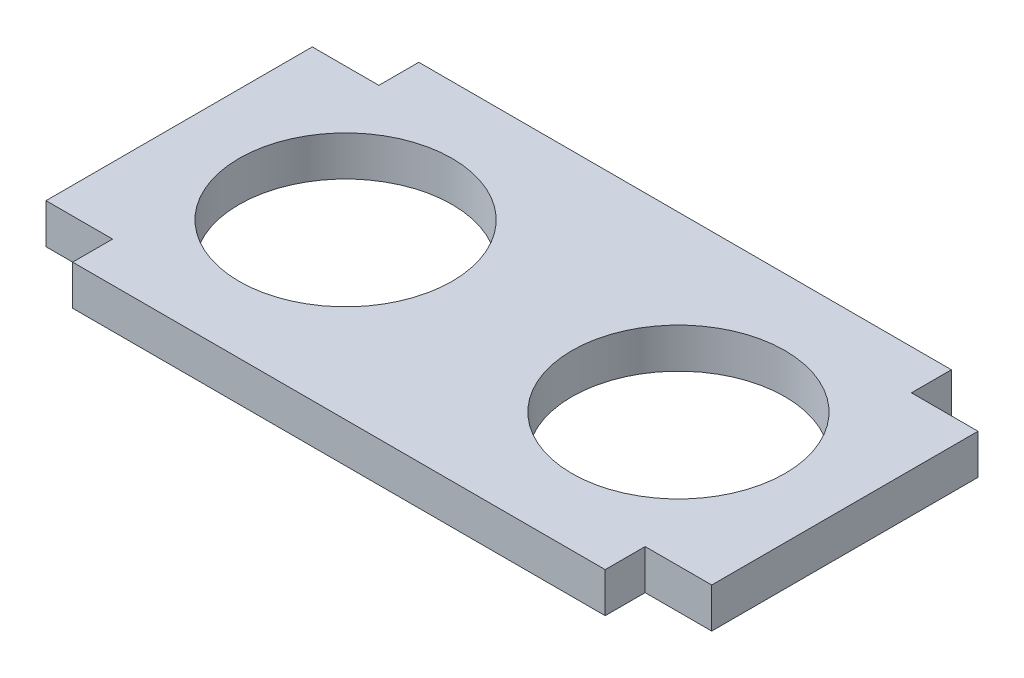
ISO-10303-21;
HEADER;
FILE_DESCRIPTION(('STEP AP214'),'2;1');
FILE_NAME('part.step','',(''),(''),'','','');
FILE_SCHEMA(('AUTOMOTIVE_DESIGN { 1 0 10303 214 1 1 1 1 }'));
ENDSEC;
DATA;
#1=APPLICATION_CONTEXT('core data for automotive mechanical design processes');
#2=APPLICATION_PROTOCOL_DEFINITION('international standard','automotive_design',2000,#1);
#3=PRODUCT_CONTEXT('',#1,'mechanical');
#4=PRODUCT('Part','Part','',(#3));
#5=PRODUCT_RELATED_PRODUCT_CATEGORY('part','',(#4));
#6=PRODUCT_DEFINITION_FORMATION('','',#4);
#7=PRODUCT_DEFINITION_CONTEXT('part definition',#1,'design');
#8=PRODUCT_DEFINITION('design','',#6,#7);
#9=PRODUCT_DEFINITION_SHAPE('','',#8);
#10=(LENGTH_UNIT() NAMED_UNIT(*) SI_UNIT(.MILLI.,.METRE.));
#11=(NAMED_UNIT(*) PLANE_ANGLE_UNIT() SI_UNIT($,.RADIAN.));
#12=(NAMED_UNIT(*) SI_UNIT($,.STERADIAN.) SOLID_ANGLE_UNIT());
#13=UNCERTAINTY_MEASURE_WITH_UNIT(LENGTH_MEASURE(1.E-05),#10,'distance_accuracy_value','');
#14=(GEOMETRIC_REPRESENTATION_CONTEXT(3) GLOBAL_UNCERTAINTY_ASSIGNED_CONTEXT((#13)) GLOBAL_UNIT_ASSIGNED_CONTEXT((#10,
#11,#12)) REPRESENTATION_CONTEXT('',''));
#15=CARTESIAN_POINT('',(0.,0.,0.));
#16=DIRECTION('',(0.,0.,1.));
#17=DIRECTION('',(1.,0.,0.));
#18=AXIS2_PLACEMENT_3D('',#15,#16,#17);
#19=CARTESIAN_POINT('',(20.,3.,-10.));
#20=DIRECTION('',(0.,0.,1.));
#21=DIRECTION('',(1.,0.,0.));
#22=AXIS2_PLACEMENT_3D('',#19,#20,#21);
#23=PLANE('',#22);
#24=DIRECTION('',(-1.,0.,0.));
#25=VECTOR('',#24,1.);
#26=CARTESIAN_POINT('',(20.,0.,-10.));
#27=LINE('',#26,#25);
#28=CARTESIAN_POINT('',(25.,0.,-10.));
#29=VERTEX_POINT('',#28);
#30=CARTESIAN_POINT('',(20.,0.,-10.));
#31=VERTEX_POINT('',#30);
#32=EDGE_CURVE('E167',#29,#31,#27,.T.);
#33=ORIENTED_EDGE('',*,*,#32,.T.);
#34=DIRECTION('',(0.,-1.,0.));
#35=VECTOR('',#34,1.);
#36=CARTESIAN_POINT('',(20.,3.,-10.));
#37=LINE('',#36,#35);
#38=CARTESIAN_POINT('',(20.,3.,-10.));
#39=VERTEX_POINT('',#38);
#40=EDGE_CURVE('E11',#39,#31,#37,.T.);
#41=ORIENTED_EDGE('',*,*,#40,.F.);
#42=DIRECTION('',(-1.,0.,0.));
#43=VECTOR('',#42,1.);
#44=CARTESIAN_POINT('',(20.,3.,-10.));
#45=LINE('',#44,#43);
#46=CARTESIAN_POINT('',(25.,3.,-10.));
#47=VERTEX_POINT('',#46);
#48=EDGE_CURVE('E202',#47,#39,#45,.T.);
#49=ORIENTED_EDGE('',*,*,#48,.F.);
#50=DIRECTION('',(0.,-1.,0.));
#51=VECTOR('',#50,1.);
#52=CARTESIAN_POINT('',(25.,3.,-10.));
#53=LINE('',#52,#51);
#54=EDGE_CURVE('E163',#47,#29,#53,.T.);
#55=ORIENTED_EDGE('',*,*,#54,.T.);
#56=EDGE_LOOP('',(#33,#41,#49,#55));
#57=FACE_BOUND('',#56,.T.);
#58=ADVANCED_FACE('F42',(#57),#23,.F.);
#59=CARTESIAN_POINT('',(20.,3.,-10.));
#60=DIRECTION('',(-1.,0.,0.));
#61=DIRECTION('',(0.,0.,1.));
#62=AXIS2_PLACEMENT_3D('',#59,#60,#61);
#63=PLANE('',#62);
#64=DIRECTION('',(0.,0.,-1.));
#65=VECTOR('',#64,1.);
#66=CARTESIAN_POINT('',(20.,0.,-10.));
#67=LINE('',#66,#65);
#68=CARTESIAN_POINT('',(20.,0.,-13.));
#69=VERTEX_POINT('',#68);
#70=EDGE_CURVE('E171',#31,#69,#67,.T.);
#71=ORIENTED_EDGE('',*,*,#70,.T.);
#72=DIRECTION('',(0.,-1.,0.));
#73=VECTOR('',#72,1.);
#74=CARTESIAN_POINT('',(20.,3.,-13.));
#75=LINE('',#74,#73);
#76=CARTESIAN_POINT('',(20.,3.,-13.));
#77=VERTEX_POINT('',#76);
#78=EDGE_CURVE('E51',#77,#69,#75,.T.);
#79=ORIENTED_EDGE('',*,*,#78,.F.);
#80=DIRECTION('',(0.,0.,-1.));
#81=VECTOR('',#80,1.);
#82=CARTESIAN_POINT('',(20.,3.,-10.));
#83=LINE('',#82,#81);
#84=EDGE_CURVE('E114',#39,#77,#83,.T.);
#85=ORIENTED_EDGE('',*,*,#84,.F.);
#86=ORIENTED_EDGE('',*,*,#40,.T.);
#87=EDGE_LOOP('',(#71,#79,#85,#86));
#88=FACE_BOUND('',#87,.T.);
#89=ADVANCED_FACE('F298',(#88),#63,.F.);
#90=CARTESIAN_POINT('',(-20.,3.,-13.));
#91=DIRECTION('',(0.,0.,1.));
#92=DIRECTION('',(1.,0.,0.));
#93=AXIS2_PLACEMENT_3D('',#90,#91,#92);
#94=PLANE('',#93);
#95=DIRECTION('',(-1.,0.,0.));
#96=VECTOR('',#95,1.);
#97=CARTESIAN_POINT('',(-20.,0.,-13.));
#98=LINE('',#97,#96);
#99=CARTESIAN_POINT('',(-20.,0.,-13.));
#100=VERTEX_POINT('',#99);
#101=EDGE_CURVE('E175',#69,#100,#98,.T.);
#102=ORIENTED_EDGE('',*,*,#101,.T.);
#103=DIRECTION('',(0.,-1.,0.));
#104=VECTOR('',#103,1.);
#105=CARTESIAN_POINT('',(-20.,3.,-13.));
#106=LINE('',#105,#104);
#107=CARTESIAN_POINT('',(-20.,3.,-13.));
#108=VERTEX_POINT('',#107);
#109=EDGE_CURVE('E229',#108,#100,#106,.T.);
#110=ORIENTED_EDGE('',*,*,#109,.F.);
#111=DIRECTION('',(-1.,0.,0.));
#112=VECTOR('',#111,1.);
#113=CARTESIAN_POINT('',(-20.,3.,-13.));
#114=LINE('',#113,#112);
#115=EDGE_CURVE('E239',#77,#108,#114,.T.);
#116=ORIENTED_EDGE('',*,*,#115,.F.);
#117=ORIENTED_EDGE('',*,*,#78,.T.);
#118=EDGE_LOOP('',(#102,#110,#116,#117));
#119=FACE_BOUND('',#118,.T.);
#120=ADVANCED_FACE('F237',(#119),#94,.F.);
#121=CARTESIAN_POINT('',(-20.,3.,-10.));
#122=DIRECTION('',(1.,0.,0.));
#123=DIRECTION('',(0.,0.,-1.));
#124=AXIS2_PLACEMENT_3D('',#121,#122,#123);
#125=PLANE('',#124);
#126=DIRECTION('',(0.,0.,1.));
#127=VECTOR('',#126,1.);
#128=CARTESIAN_POINT('',(-20.,0.,-10.));
#129=LINE('',#128,#127);
#130=CARTESIAN_POINT('',(-20.,0.,-10.));
#131=VERTEX_POINT('',#130);
#132=EDGE_CURVE('E178',#100,#131,#129,.T.);
#133=ORIENTED_EDGE('',*,*,#132,.T.);
#134=DIRECTION('',(0.,-1.,0.));
#135=VECTOR('',#134,1.);
#136=CARTESIAN_POINT('',(-20.,3.,-10.));
#137=LINE('',#136,#135);
#138=CARTESIAN_POINT('',(-20.,3.,-10.));
#139=VERTEX_POINT('',#138);
#140=EDGE_CURVE('E225',#139,#131,#137,.T.);
#141=ORIENTED_EDGE('',*,*,#140,.F.);
#142=DIRECTION('',(0.,0.,1.));
#143=VECTOR('',#142,1.);
#144=CARTESIAN_POINT('',(-20.,3.,-10.));
#145=LINE('',#144,#143);
#146=EDGE_CURVE('E258',#108,#139,#145,.T.);
#147=ORIENTED_EDGE('',*,*,#146,.F.);
#148=ORIENTED_EDGE('',*,*,#109,.T.);
#149=EDGE_LOOP('',(#133,#141,#147,#148));
#150=FACE_BOUND('',#149,.T.);
#151=ADVANCED_FACE('F248',(#150),#125,.F.);
#152=CARTESIAN_POINT('',(-25.,3.,-10.));
#153=DIRECTION('',(0.,0.,1.));
#154=DIRECTION('',(1.,0.,0.));
#155=AXIS2_PLACEMENT_3D('',#152,#153,#154);
#156=PLANE('',#155);
#157=DIRECTION('',(-1.,0.,0.));
#158=VECTOR('',#157,1.);
#159=CARTESIAN_POINT('',(-25.,0.,-10.));
#160=LINE('',#159,#158);
#161=CARTESIAN_POINT('',(-25.,0.,-10.));
#162=VERTEX_POINT('',#161);
#163=EDGE_CURVE('E181',#131,#162,#160,.T.);
#164=ORIENTED_EDGE('',*,*,#163,.T.);
#165=DIRECTION('',(0.,-1.,0.));
#166=VECTOR('',#165,1.);
#167=CARTESIAN_POINT('',(-25.,3.,-10.));
#168=LINE('',#167,#166);
#169=CARTESIAN_POINT('',(-25.,3.,-10.));
#170=VERTEX_POINT('',#169);
#171=EDGE_CURVE('E221',#170,#162,#168,.T.);
#172=ORIENTED_EDGE('',*,*,#171,.F.);
#173=DIRECTION('',(-1.,0.,0.));
#174=VECTOR('',#173,1.);
#175=CARTESIAN_POINT('',(-25.,3.,-10.));
#176=LINE('',#175,#174);
#177=EDGE_CURVE('E254',#139,#170,#176,.T.);
#178=ORIENTED_EDGE('',*,*,#177,.F.);
#179=ORIENTED_EDGE('',*,*,#140,.T.);
#180=EDGE_LOOP('',(#164,#172,#178,#179));
#181=FACE_BOUND('',#180,.T.);
#182=ADVANCED_FACE('F252',(#181),#156,.F.);
#183=CARTESIAN_POINT('',(-25.,3.,10.));
#184=DIRECTION('',(1.,0.,0.));
#185=DIRECTION('',(0.,0.,-1.));
#186=AXIS2_PLACEMENT_3D('',#183,#184,#185);
#187=PLANE('',#186);
#188=DIRECTION('',(0.,0.,1.));
#189=VECTOR('',#188,1.);
#190=CARTESIAN_POINT('',(-25.,0.,10.));
#191=LINE('',#190,#189);
#192=CARTESIAN_POINT('',(-25.,0.,10.));
#193=VERTEX_POINT('',#192);
#194=EDGE_CURVE('E184',#162,#193,#191,.T.);
#195=ORIENTED_EDGE('',*,*,#194,.T.);
#196=DIRECTION('',(0.,-1.,0.));
#197=VECTOR('',#196,1.);
#198=CARTESIAN_POINT('',(-25.,3.,10.));
#199=LINE('',#198,#197);
#200=CARTESIAN_POINT('',(-25.,3.,10.));
#201=VERTEX_POINT('',#200);
#202=EDGE_CURVE('E217',#201,#193,#199,.T.);
#203=ORIENTED_EDGE('',*,*,#202,.F.);
#204=DIRECTION('',(0.,0.,1.));
#205=VECTOR('',#204,1.);
#206=CARTESIAN_POINT('',(-25.,3.,10.));
#207=LINE('',#206,#205);
#208=EDGE_CURVE('E257',#170,#201,#207,.T.);
#209=ORIENTED_EDGE('',*,*,#208,.F.);
#210=ORIENTED_EDGE('',*,*,#171,.T.);
#211=EDGE_LOOP('',(#195,#203,#209,#210));
#212=FACE_BOUND('',#211,.T.);
#213=ADVANCED_FACE('F311',(#212),#187,.F.);
#214=CARTESIAN_POINT('',(-25.,3.,10.));
#215=DIRECTION('',(0.,0.,-1.));
#216=DIRECTION('',(-1.,0.,0.));
#217=AXIS2_PLACEMENT_3D('',#214,#215,#216);
#218=PLANE('',#217);
#219=DIRECTION('',(1.,0.,0.));
#220=VECTOR('',#219,1.);
#221=CARTESIAN_POINT('',(-25.,0.,10.));
#222=LINE('',#221,#220);
#223=CARTESIAN_POINT('',(-20.,0.,10.));
#224=VERTEX_POINT('',#223);
#225=EDGE_CURVE('E187',#193,#224,#222,.T.);
#226=ORIENTED_EDGE('',*,*,#225,.T.);
#227=DIRECTION('',(0.,-1.,0.));
#228=VECTOR('',#227,1.);
#229=CARTESIAN_POINT('',(-20.,3.,10.));
#230=LINE('',#229,#228);
#231=CARTESIAN_POINT('',(-20.,3.,10.));
#232=VERTEX_POINT('',#231);
#233=EDGE_CURVE('E213',#232,#224,#230,.T.);
#234=ORIENTED_EDGE('',*,*,#233,.F.);
#235=DIRECTION('',(1.,0.,0.));
#236=VECTOR('',#235,1.);
#237=CARTESIAN_POINT('',(-25.,3.,10.));
#238=LINE('',#237,#236);
#239=EDGE_CURVE('E262',#201,#232,#238,.T.);
#240=ORIENTED_EDGE('',*,*,#239,.F.);
#241=ORIENTED_EDGE('',*,*,#202,.T.);
#242=EDGE_LOOP('',(#226,#234,#240,#241));
#243=FACE_BOUND('',#242,.T.);
#244=ADVANCED_FACE('F314',(#243),#218,.F.);
#245=CARTESIAN_POINT('',(-20.,3.,13.));
#246=DIRECTION('',(1.,0.,0.));
#247=DIRECTION('',(0.,0.,-1.));
#248=AXIS2_PLACEMENT_3D('',#245,#246,#247);
#249=PLANE('',#248);
#250=DIRECTION('',(0.,0.,1.));
#251=VECTOR('',#250,1.);
#252=CARTESIAN_POINT('',(-20.,0.,13.));
#253=LINE('',#252,#251);
#254=CARTESIAN_POINT('',(-20.,0.,13.));
#255=VERTEX_POINT('',#254);
#256=EDGE_CURVE('E190',#224,#255,#253,.T.);
#257=ORIENTED_EDGE('',*,*,#256,.T.);
#258=DIRECTION('',(0.,-1.,0.));
#259=VECTOR('',#258,1.);
#260=CARTESIAN_POINT('',(-20.,3.,13.));
#261=LINE('',#260,#259);
#262=CARTESIAN_POINT('',(-20.,3.,13.));
#263=VERTEX_POINT('',#262);
#264=EDGE_CURVE('E209',#263,#255,#261,.T.);
#265=ORIENTED_EDGE('',*,*,#264,.F.);
#266=DIRECTION('',(0.,0.,1.));
#267=VECTOR('',#266,1.);
#268=CARTESIAN_POINT('',(-20.,3.,13.));
#269=LINE('',#268,#267);
#270=EDGE_CURVE('E269',#232,#263,#269,.T.);
#271=ORIENTED_EDGE('',*,*,#270,.F.);
#272=ORIENTED_EDGE('',*,*,#233,.T.);
#273=EDGE_LOOP('',(#257,#265,#271,#272));
#274=FACE_BOUND('',#273,.T.);
#275=ADVANCED_FACE('F277',(#274),#249,.F.);
#276=CARTESIAN_POINT('',(-20.,3.,13.));
#277=DIRECTION('',(0.,0.,-1.));
#278=DIRECTION('',(-1.,0.,0.));
#279=AXIS2_PLACEMENT_3D('',#276,#277,#278);
#280=PLANE('',#279);
#281=DIRECTION('',(1.,0.,0.));
#282=VECTOR('',#281,1.);
#283=CARTESIAN_POINT('',(-20.,0.,13.));
#284=LINE('',#283,#282);
#285=CARTESIAN_POINT('',(20.,0.,13.));
#286=VERTEX_POINT('',#285);
#287=EDGE_CURVE('E193',#255,#286,#284,.T.);
#288=ORIENTED_EDGE('',*,*,#287,.T.);
#289=DIRECTION('',(0.,-1.,0.));
#290=VECTOR('',#289,1.);
#291=CARTESIAN_POINT('',(20.,3.,13.));
#292=LINE('',#291,#290);
#293=CARTESIAN_POINT('',(20.,3.,13.));
#294=VERTEX_POINT('',#293);
#295=EDGE_CURVE('E156',#294,#286,#292,.T.);
#296=ORIENTED_EDGE('',*,*,#295,.F.);
#297=DIRECTION('',(1.,0.,0.));
#298=VECTOR('',#297,1.);
#299=CARTESIAN_POINT('',(-20.,3.,13.));
#300=LINE('',#299,#298);
#301=EDGE_CURVE('E145',#263,#294,#300,.T.);
#302=ORIENTED_EDGE('',*,*,#301,.F.);
#303=ORIENTED_EDGE('',*,*,#264,.T.);
#304=EDGE_LOOP('',(#288,#296,#302,#303));
#305=FACE_BOUND('',#304,.T.);
#306=ADVANCED_FACE('F281',(#305),#280,.F.);
#307=CARTESIAN_POINT('',(20.,3.,13.));
#308=DIRECTION('',(-1.,0.,0.));
#309=DIRECTION('',(0.,0.,1.));
#310=AXIS2_PLACEMENT_3D('',#307,#308,#309);
#311=PLANE('',#310);
#312=DIRECTION('',(0.,0.,-1.));
#313=VECTOR('',#312,1.);
#314=CARTESIAN_POINT('',(20.,0.,13.));
#315=LINE('',#314,#313);
#316=CARTESIAN_POINT('',(20.,0.,10.));
#317=VERTEX_POINT('',#316);
#318=EDGE_CURVE('E154',#286,#317,#315,.T.);
#319=ORIENTED_EDGE('',*,*,#318,.T.);
#320=DIRECTION('',(0.,-1.,0.));
#321=VECTOR('',#320,1.);
#322=CARTESIAN_POINT('',(20.,3.,10.));
#323=LINE('',#322,#321);
#324=CARTESIAN_POINT('',(20.,3.,10.));
#325=VERTEX_POINT('',#324);
#326=EDGE_CURVE('E151',#325,#317,#323,.T.);
#327=ORIENTED_EDGE('',*,*,#326,.F.);
#328=DIRECTION('',(0.,0.,-1.));
#329=VECTOR('',#328,1.);
#330=CARTESIAN_POINT('',(20.,3.,13.));
#331=LINE('',#330,#329);
#332=EDGE_CURVE('E139',#294,#325,#331,.T.);
#333=ORIENTED_EDGE('',*,*,#332,.F.);
#334=ORIENTED_EDGE('',*,*,#295,.T.);
#335=EDGE_LOOP('',(#319,#327,#333,#334));
#336=FACE_BOUND('',#335,.T.);
#337=ADVANCED_FACE('F152',(#336),#311,.F.);
#338=CARTESIAN_POINT('',(20.,3.,10.));
#339=DIRECTION('',(0.,0.,-1.));
#340=DIRECTION('',(-1.,0.,0.));
#341=AXIS2_PLACEMENT_3D('',#338,#339,#340);
#342=PLANE('',#341);
#343=DIRECTION('',(1.,0.,0.));
#344=VECTOR('',#343,1.);
#345=CARTESIAN_POINT('',(20.,0.,10.));
#346=LINE('',#345,#344);
#347=CARTESIAN_POINT('',(25.,0.,10.));
#348=VERTEX_POINT('',#347);
#349=EDGE_CURVE('E100',#317,#348,#346,.T.);
#350=ORIENTED_EDGE('',*,*,#349,.T.);
#351=DIRECTION('',(0.,-1.,0.));
#352=VECTOR('',#351,1.);
#353=CARTESIAN_POINT('',(25.,3.,10.));
#354=LINE('',#353,#352);
#355=CARTESIAN_POINT('',(25.,3.,10.));
#356=VERTEX_POINT('',#355);
#357=EDGE_CURVE('E157',#356,#348,#354,.T.);
#358=ORIENTED_EDGE('',*,*,#357,.F.);
#359=DIRECTION('',(1.,0.,0.));
#360=VECTOR('',#359,1.);
#361=CARTESIAN_POINT('',(20.,3.,10.));
#362=LINE('',#361,#360);
#363=EDGE_CURVE('E143',#325,#356,#362,.T.);
#364=ORIENTED_EDGE('',*,*,#363,.F.);
#365=ORIENTED_EDGE('',*,*,#326,.T.);
#366=EDGE_LOOP('',(#350,#358,#364,#365));
#367=FACE_BOUND('',#366,.T.);
#368=ADVANCED_FACE('F159',(#367),#342,.F.);
#369=CARTESIAN_POINT('',(25.,3.,10.));
#370=DIRECTION('',(-1.,0.,0.));
#371=DIRECTION('',(0.,0.,1.));
#372=AXIS2_PLACEMENT_3D('',#369,#370,#371);
#373=PLANE('',#372);
#374=DIRECTION('',(0.,0.,-1.));
#375=VECTOR('',#374,1.);
#376=CARTESIAN_POINT('',(25.,0.,10.));
#377=LINE('',#376,#375);
#378=EDGE_CURVE('E106',#348,#29,#377,.T.);
#379=ORIENTED_EDGE('',*,*,#378,.T.);
#380=ORIENTED_EDGE('',*,*,#54,.F.);
#381=DIRECTION('',(0.,0.,-1.));
#382=VECTOR('',#381,1.);
#383=CARTESIAN_POINT('',(25.,3.,10.));
#384=LINE('',#383,#382);
#385=EDGE_CURVE('E59',#356,#47,#384,.T.);
#386=ORIENTED_EDGE('',*,*,#385,.F.);
#387=ORIENTED_EDGE('',*,*,#357,.T.);
#388=EDGE_LOOP('',(#379,#380,#386,#387));
#389=FACE_BOUND('',#388,.T.);
#390=ADVANCED_FACE('F285',(#389),#373,.F.);
#391=CARTESIAN_POINT('',(0.,3.,0.));
#392=DIRECTION('',(0.,1.,0.));
#393=DIRECTION('',(0.,0.,1.));
#394=AXIS2_PLACEMENT_3D('',#391,#392,#393);
#395=PLANE('',#394);
#396=CARTESIAN_POINT('',(12.5,3.,0.));
#397=DIRECTION('',(0.,1.,0.));
#398=DIRECTION('',(0.,0.,1.));
#399=AXIS2_PLACEMENT_3D('',#396,#397,#398);
#400=CIRCLE('',#399,8.);
#401=CARTESIAN_POINT('',(12.5,3.,8.));
#402=VERTEX_POINT('',#401);
#403=EDGE_CURVE('E460',#402,#402,#400,.T.);
#404=ORIENTED_EDGE('',*,*,#403,.F.);
#405=EDGE_LOOP('',(#404));
#406=FACE_BOUND('',#405,.T.);
#407=CARTESIAN_POINT('',(-12.5,3.,0.));
#408=DIRECTION('',(0.,1.,0.));
#409=DIRECTION('',(0.,0.,-1.));
#410=AXIS2_PLACEMENT_3D('',#407,#408,#409);
#411=CIRCLE('',#410,8.);
#412=CARTESIAN_POINT('',(-12.5,3.,-8.));
#413=VERTEX_POINT('',#412);
#414=EDGE_CURVE('E462',#413,#413,#411,.T.);
#415=ORIENTED_EDGE('',*,*,#414,.F.);
#416=EDGE_LOOP('',(#415));
#417=FACE_BOUND('',#416,.T.);
#418=ORIENTED_EDGE('',*,*,#48,.T.);
#419=ORIENTED_EDGE('',*,*,#84,.T.);
#420=ORIENTED_EDGE('',*,*,#115,.T.);
#421=ORIENTED_EDGE('',*,*,#146,.T.);
#422=ORIENTED_EDGE('',*,*,#177,.T.);
#423=ORIENTED_EDGE('',*,*,#208,.T.);
#424=ORIENTED_EDGE('',*,*,#239,.T.);
#425=ORIENTED_EDGE('',*,*,#270,.T.);
#426=ORIENTED_EDGE('',*,*,#301,.T.);
#427=ORIENTED_EDGE('',*,*,#332,.T.);
#428=ORIENTED_EDGE('',*,*,#363,.T.);
#429=ORIENTED_EDGE('',*,*,#385,.T.);
#430=EDGE_LOOP('',(#418,#419,#420,#421,#422,#423,#424,#425,#426,#427,#428,#429));
#431=FACE_BOUND('',#430,.T.);
#432=ADVANCED_FACE('F141',(#406,#417,#431),#395,.T.);
#433=CARTESIAN_POINT('',(0.,0.,0.));
#434=DIRECTION('',(0.,1.,0.));
#435=DIRECTION('',(0.,0.,1.));
#436=AXIS2_PLACEMENT_3D('',#433,#434,#435);
#437=PLANE('',#436);
#438=CARTESIAN_POINT('',(12.5,0.,0.));
#439=DIRECTION('',(0.,1.,0.));
#440=DIRECTION('',(0.,0.,1.));
#441=AXIS2_PLACEMENT_3D('',#438,#439,#440);
#442=CIRCLE('',#441,8.);
#443=CARTESIAN_POINT('',(12.5,0.,8.));
#444=VERTEX_POINT('',#443);
#445=EDGE_CURVE('E172',#444,#444,#442,.T.);
#446=ORIENTED_EDGE('',*,*,#445,.T.);
#447=EDGE_LOOP('',(#446));
#448=FACE_BOUND('',#447,.T.);
#449=CARTESIAN_POINT('',(-12.5,0.,0.));
#450=DIRECTION('',(0.,1.,0.));
#451=DIRECTION('',(0.,0.,-1.));
#452=AXIS2_PLACEMENT_3D('',#449,#450,#451);
#453=CIRCLE('',#452,8.);
#454=CARTESIAN_POINT('',(-12.5,0.,-8.));
#455=VERTEX_POINT('',#454);
#456=EDGE_CURVE('E468',#455,#455,#453,.T.);
#457=ORIENTED_EDGE('',*,*,#456,.T.);
#458=EDGE_LOOP('',(#457));
#459=FACE_BOUND('',#458,.T.);
#460=ORIENTED_EDGE('',*,*,#32,.F.);
#461=ORIENTED_EDGE('',*,*,#378,.F.);
#462=ORIENTED_EDGE('',*,*,#349,.F.);
#463=ORIENTED_EDGE('',*,*,#318,.F.);
#464=ORIENTED_EDGE('',*,*,#287,.F.);
#465=ORIENTED_EDGE('',*,*,#256,.F.);
#466=ORIENTED_EDGE('',*,*,#225,.F.);
#467=ORIENTED_EDGE('',*,*,#194,.F.);
#468=ORIENTED_EDGE('',*,*,#163,.F.);
#469=ORIENTED_EDGE('',*,*,#132,.F.);
#470=ORIENTED_EDGE('',*,*,#101,.F.);
#471=ORIENTED_EDGE('',*,*,#70,.F.);
#472=EDGE_LOOP('',(#460,#461,#462,#463,#464,#465,#466,#467,#468,#469,#470,#471));
#473=FACE_BOUND('',#472,.T.);
#474=ADVANCED_FACE('F243',(#448,#459,#473),#437,.F.);
#475=CARTESIAN_POINT('',(-12.5,0.,0.));
#476=DIRECTION('',(0.,1.,0.));
#477=DIRECTION('',(0.,0.,1.));
#478=AXIS2_PLACEMENT_3D('',#475,#476,#477);
#479=CYLINDRICAL_SURFACE('',#478,8.);
#480=ORIENTED_EDGE('',*,*,#456,.F.);
#481=EDGE_LOOP('',(#480));
#482=FACE_BOUND('',#481,.T.);
#483=ORIENTED_EDGE('',*,*,#414,.T.);
#484=EDGE_LOOP('',(#483));
#485=FACE_BOUND('',#484,.T.);
#486=ADVANCED_FACE('F349',(#482,#485),#479,.F.);
#487=CARTESIAN_POINT('',(12.5,0.,0.));
#488=DIRECTION('',(0.,1.,0.));
#489=DIRECTION('',(0.,0.,1.));
#490=AXIS2_PLACEMENT_3D('',#487,#488,#489);
#491=CYLINDRICAL_SURFACE('',#490,8.);
#492=ORIENTED_EDGE('',*,*,#445,.F.);
#493=EDGE_LOOP('',(#492));
#494=FACE_BOUND('',#493,.T.);
#495=ORIENTED_EDGE('',*,*,#403,.T.);
#496=EDGE_LOOP('',(#495));
#497=FACE_BOUND('',#496,.T.);
#498=ADVANCED_FACE('F357',(#494,#497),#491,.F.);
#499=CLOSED_SHELL('',(#58,#89,#120,#151,#182,#213,#244,#275,#306,#337,#368,#390,#432,#474,#486,#498));
#500=MANIFOLD_SOLID_BREP('B2',#499);
#501=ADVANCED_BREP_SHAPE_REPRESENTATION('',(#18,#500),#14);
#502=SHAPE_DEFINITION_REPRESENTATION(#9,#501);
ENDSEC;
END-ISO-10303-21;
